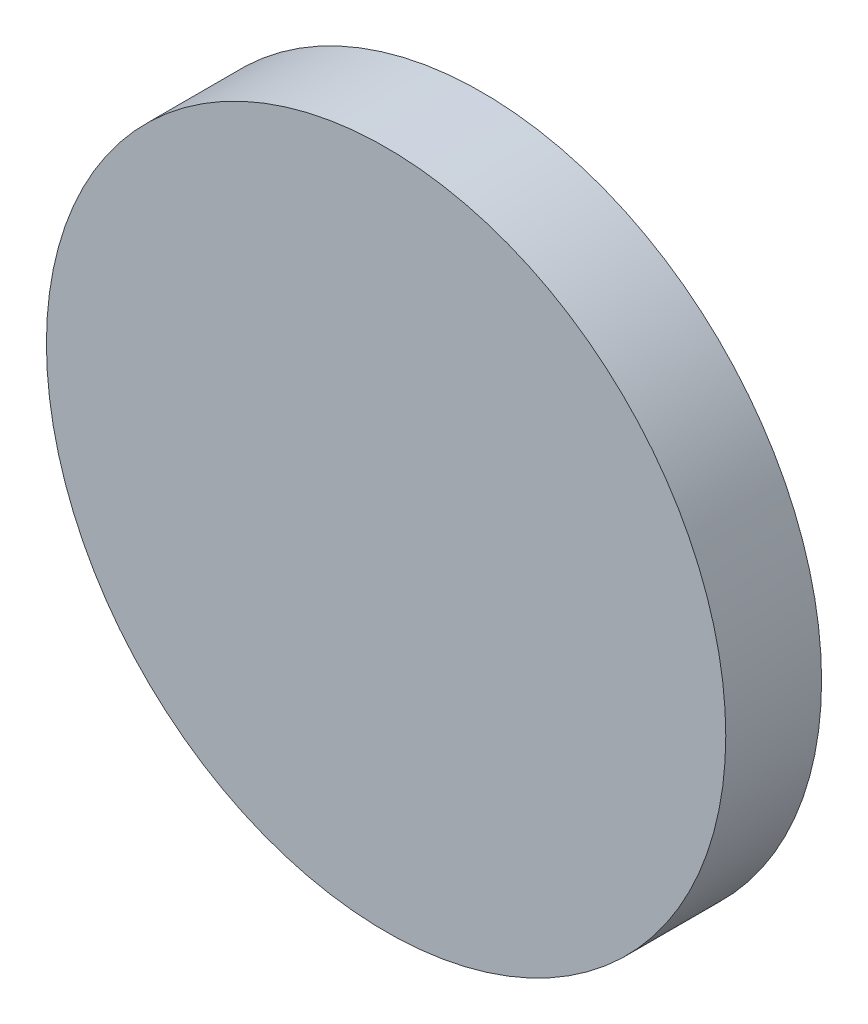
ISO-10303-21;
HEADER;
FILE_DESCRIPTION(('STEP AP214'),'2;1');
FILE_NAME('part.step','',(''),(''),'','','');
FILE_SCHEMA(('AUTOMOTIVE_DESIGN { 1 0 10303 214 1 1 1 1 }'));
ENDSEC;
DATA;
#1=APPLICATION_CONTEXT('core data for automotive mechanical design processes');
#2=APPLICATION_PROTOCOL_DEFINITION('international standard','automotive_design',2000,#1);
#3=PRODUCT_CONTEXT('',#1,'mechanical');
#4=PRODUCT('Part','Part','',(#3));
#5=PRODUCT_RELATED_PRODUCT_CATEGORY('part','',(#4));
#6=PRODUCT_DEFINITION_FORMATION('','',#4);
#7=PRODUCT_DEFINITION_CONTEXT('part definition',#1,'design');
#8=PRODUCT_DEFINITION('design','',#6,#7);
#9=PRODUCT_DEFINITION_SHAPE('','',#8);
#10=(LENGTH_UNIT() NAMED_UNIT(*) SI_UNIT(.MILLI.,.METRE.));
#11=(NAMED_UNIT(*) PLANE_ANGLE_UNIT() SI_UNIT($,.RADIAN.));
#12=(NAMED_UNIT(*) SI_UNIT($,.STERADIAN.) SOLID_ANGLE_UNIT());
#13=UNCERTAINTY_MEASURE_WITH_UNIT(LENGTH_MEASURE(1.E-05),#10,'distance_accuracy_value','');
#14=(GEOMETRIC_REPRESENTATION_CONTEXT(3) GLOBAL_UNCERTAINTY_ASSIGNED_CONTEXT((#13)) GLOBAL_UNIT_ASSIGNED_CONTEXT((#10,
#11,#12)) REPRESENTATION_CONTEXT('',''));
#15=CARTESIAN_POINT('',(0.,0.,0.));
#16=DIRECTION('',(0.,0.,1.));
#17=DIRECTION('',(1.,0.,0.));
#18=AXIS2_PLACEMENT_3D('',#15,#16,#17);
#19=CARTESIAN_POINT('',(0.,0.,15.35));
#20=DIRECTION('',(0.,0.,1.));
#21=DIRECTION('',(1.,0.,0.));
#22=AXIS2_PLACEMENT_3D('',#19,#20,#21);
#23=PLANE('',#22);
#24=CARTESIAN_POINT('',(0.,0.,15.35));
#25=DIRECTION('',(0.,0.,1.));
#26=DIRECTION('',(1.,0.,0.));
#27=AXIS2_PLACEMENT_3D('',#24,#25,#26);
#28=CIRCLE('',#27,9.75);
#29=CARTESIAN_POINT('',(-9.75,0.,15.35));
#30=VERTEX_POINT('',#29);
#31=EDGE_CURVE('E25',#30,#30,#28,.T.);
#32=ORIENTED_EDGE('',*,*,#31,.T.);
#33=EDGE_LOOP('',(#32));
#34=FACE_BOUND('',#33,.T.);
#35=ADVANCED_FACE('F15',(#34),#23,.T.);
#36=CARTESIAN_POINT('',(0.,0.,12.6));
#37=DIRECTION('',(0.,0.,-1.));
#38=DIRECTION('',(0.,-1.,0.));
#39=AXIS2_PLACEMENT_3D('',#36,#37,#38);
#40=PLANE('',#39);
#41=CARTESIAN_POINT('',(0.,0.,12.6));
#42=DIRECTION('',(0.,0.,-1.));
#43=DIRECTION('',(1.,0.,0.));
#44=AXIS2_PLACEMENT_3D('',#41,#42,#43);
#45=CIRCLE('',#44,9.75);
#46=CARTESIAN_POINT('',(-9.75,0.,12.6));
#47=VERTEX_POINT('',#46);
#48=EDGE_CURVE('E10',#47,#47,#45,.T.);
#49=ORIENTED_EDGE('',*,*,#48,.T.);
#50=EDGE_LOOP('',(#49));
#51=FACE_BOUND('',#50,.T.);
#52=ADVANCED_FACE('F17',(#51),#40,.T.);
#53=CARTESIAN_POINT('',(0.,0.,13.975));
#54=DIRECTION('',(0.,0.,1.));
#55=DIRECTION('',(1.,0.,0.));
#56=AXIS2_PLACEMENT_3D('',#53,#54,#55);
#57=CYLINDRICAL_SURFACE('',#56,9.75);
#58=ORIENTED_EDGE('',*,*,#48,.F.);
#59=EDGE_LOOP('',(#58));
#60=FACE_BOUND('',#59,.T.);
#61=ORIENTED_EDGE('',*,*,#31,.F.);
#62=EDGE_LOOP('',(#61));
#63=FACE_BOUND('',#62,.T.);
#64=ADVANCED_FACE('F45',(#60,#63),#57,.T.);
#65=CLOSED_SHELL('',(#35,#52,#64));
#66=MANIFOLD_SOLID_BREP('B1',#65);
#67=ADVANCED_BREP_SHAPE_REPRESENTATION('',(#18,#66),#14);
#68=SHAPE_DEFINITION_REPRESENTATION(#9,#67);
ENDSEC;
END-ISO-10303-21;
